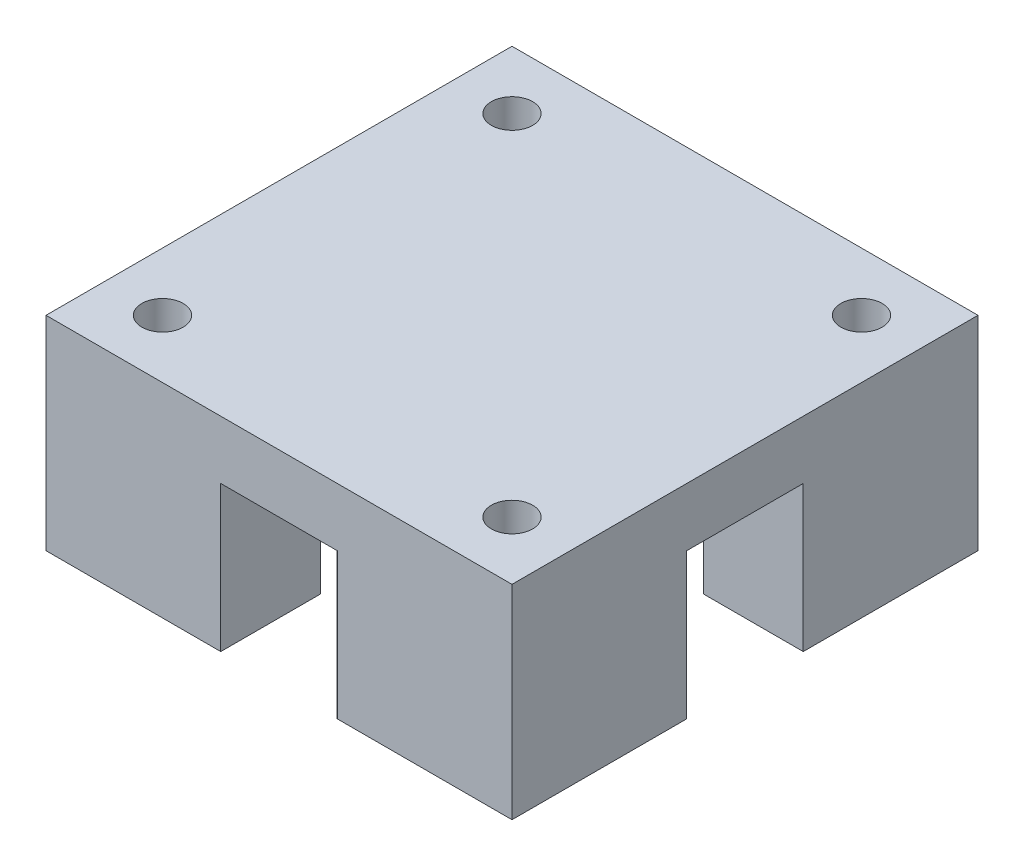
ISO-10303-21;
HEADER;
FILE_DESCRIPTION(('STEP AP214'),'2;1');
FILE_NAME('part.step','',(''),(''),'','','');
FILE_SCHEMA(('AUTOMOTIVE_DESIGN { 1 0 10303 214 1 1 1 1 }'));
ENDSEC;
DATA;
#1=APPLICATION_CONTEXT('core data for automotive mechanical design processes');
#2=APPLICATION_PROTOCOL_DEFINITION('international standard','automotive_design',2000,#1);
#3=PRODUCT_CONTEXT('',#1,'mechanical');
#4=PRODUCT('Part','Part','',(#3));
#5=PRODUCT_RELATED_PRODUCT_CATEGORY('part','',(#4));
#6=PRODUCT_DEFINITION_FORMATION('','',#4);
#7=PRODUCT_DEFINITION_CONTEXT('part definition',#1,'design');
#8=PRODUCT_DEFINITION('design','',#6,#7);
#9=PRODUCT_DEFINITION_SHAPE('','',#8);
#10=(LENGTH_UNIT() NAMED_UNIT(*) SI_UNIT(.MILLI.,.METRE.));
#11=(NAMED_UNIT(*) PLANE_ANGLE_UNIT() SI_UNIT($,.RADIAN.));
#12=(NAMED_UNIT(*) SI_UNIT($,.STERADIAN.) SOLID_ANGLE_UNIT());
#13=UNCERTAINTY_MEASURE_WITH_UNIT(LENGTH_MEASURE(1.E-05),#10,'distance_accuracy_value','');
#14=(GEOMETRIC_REPRESENTATION_CONTEXT(3) GLOBAL_UNCERTAINTY_ASSIGNED_CONTEXT((#13)) GLOBAL_UNIT_ASSIGNED_CONTEXT((#10,
#11,#12)) REPRESENTATION_CONTEXT('',''));
#15=CARTESIAN_POINT('',(0.,0.,0.));
#16=DIRECTION('',(0.,0.,1.));
#17=DIRECTION('',(1.,0.,0.));
#18=AXIS2_PLACEMENT_3D('',#15,#16,#17);
#19=CARTESIAN_POINT('',(25.4,22.225,-25.4));
#20=DIRECTION('',(-1.,0.,0.));
#21=DIRECTION('',(0.,0.,1.));
#22=AXIS2_PLACEMENT_3D('',#19,#20,#21);
#23=PLANE('',#22);
#24=DIRECTION('',(0.,-1.,0.));
#25=VECTOR('',#24,1.);
#26=CARTESIAN_POINT('',(25.4,15.875,6.35));
#27=LINE('',#26,#25);
#28=CARTESIAN_POINT('',(25.4,15.875,6.35));
#29=VERTEX_POINT('',#28);
#30=CARTESIAN_POINT('',(25.4,0.,6.35));
#31=VERTEX_POINT('',#30);
#32=EDGE_CURVE('E297',#29,#31,#27,.T.);
#33=ORIENTED_EDGE('',*,*,#32,.F.);
#34=DIRECTION('',(0.,0.,1.));
#35=VECTOR('',#34,1.);
#36=CARTESIAN_POINT('',(25.4,15.875,0.));
#37=LINE('',#36,#35);
#38=CARTESIAN_POINT('',(25.4,15.875,-6.35));
#39=VERTEX_POINT('',#38);
#40=EDGE_CURVE('E195',#39,#29,#37,.T.);
#41=ORIENTED_EDGE('',*,*,#40,.F.);
#42=DIRECTION('',(0.,-1.,0.));
#43=VECTOR('',#42,1.);
#44=CARTESIAN_POINT('',(25.4,15.875,-6.35));
#45=LINE('',#44,#43);
#46=CARTESIAN_POINT('',(25.4,0.,-6.35));
#47=VERTEX_POINT('',#46);
#48=EDGE_CURVE('E185',#39,#47,#45,.T.);
#49=ORIENTED_EDGE('',*,*,#48,.T.);
#50=DIRECTION('',(0.,0.,-1.));
#51=VECTOR('',#50,1.);
#52=CARTESIAN_POINT('',(25.4,0.,-25.4));
#53=LINE('',#52,#51);
#54=CARTESIAN_POINT('',(25.4,0.,-25.4));
#55=VERTEX_POINT('',#54);
#56=EDGE_CURVE('E323',#47,#55,#53,.T.);
#57=ORIENTED_EDGE('',*,*,#56,.T.);
#58=DIRECTION('',(0.,-1.,0.));
#59=VECTOR('',#58,1.);
#60=CARTESIAN_POINT('',(25.4,22.225,-25.4));
#61=LINE('',#60,#59);
#62=CARTESIAN_POINT('',(25.4,22.225,-25.4));
#63=VERTEX_POINT('',#62);
#64=EDGE_CURVE('E11',#63,#55,#61,.T.);
#65=ORIENTED_EDGE('',*,*,#64,.F.);
#66=DIRECTION('',(0.,0.,-1.));
#67=VECTOR('',#66,1.);
#68=CARTESIAN_POINT('',(25.4,22.225,-25.4));
#69=LINE('',#68,#67);
#70=CARTESIAN_POINT('',(25.4,22.225,25.4));
#71=VERTEX_POINT('',#70);
#72=EDGE_CURVE('E324',#71,#63,#69,.T.);
#73=ORIENTED_EDGE('',*,*,#72,.F.);
#74=DIRECTION('',(0.,-1.,0.));
#75=VECTOR('',#74,1.);
#76=CARTESIAN_POINT('',(25.4,22.225,25.4));
#77=LINE('',#76,#75);
#78=CARTESIAN_POINT('',(25.4,0.,25.4));
#79=VERTEX_POINT('',#78);
#80=EDGE_CURVE('E331',#71,#79,#77,.T.);
#81=ORIENTED_EDGE('',*,*,#80,.T.);
#82=EDGE_CURVE('E332',#79,#31,#53,.T.);
#83=ORIENTED_EDGE('',*,*,#82,.T.);
#84=EDGE_LOOP('',(#33,#41,#49,#57,#65,#73,#81,#83));
#85=FACE_BOUND('',#84,.T.);
#86=ADVANCED_FACE('F35',(#85),#23,.F.);
#87=CARTESIAN_POINT('',(-25.4,22.225,-25.4));
#88=DIRECTION('',(0.,0.,1.));
#89=DIRECTION('',(1.,0.,0.));
#90=AXIS2_PLACEMENT_3D('',#87,#88,#89);
#91=PLANE('',#90);
#92=DIRECTION('',(0.,-1.,0.));
#93=VECTOR('',#92,1.);
#94=CARTESIAN_POINT('',(6.35,15.875,-25.4));
#95=LINE('',#94,#93);
#96=CARTESIAN_POINT('',(6.35,15.875,-25.4));
#97=VERTEX_POINT('',#96);
#98=CARTESIAN_POINT('',(6.35,0.,-25.4));
#99=VERTEX_POINT('',#98);
#100=EDGE_CURVE('E271',#97,#99,#95,.T.);
#101=ORIENTED_EDGE('',*,*,#100,.F.);
#102=DIRECTION('',(1.,0.,0.));
#103=VECTOR('',#102,1.);
#104=CARTESIAN_POINT('',(0.,15.875,-25.4));
#105=LINE('',#104,#103);
#106=CARTESIAN_POINT('',(-6.35,15.875,-25.4));
#107=VERTEX_POINT('',#106);
#108=EDGE_CURVE('E237',#107,#97,#105,.T.);
#109=ORIENTED_EDGE('',*,*,#108,.F.);
#110=DIRECTION('',(0.,-1.,0.));
#111=VECTOR('',#110,1.);
#112=CARTESIAN_POINT('',(-6.35,15.875,-25.4));
#113=LINE('',#112,#111);
#114=CARTESIAN_POINT('',(-6.35,0.,-25.4));
#115=VERTEX_POINT('',#114);
#116=EDGE_CURVE('E273',#107,#115,#113,.T.);
#117=ORIENTED_EDGE('',*,*,#116,.T.);
#118=DIRECTION('',(-1.,0.,0.));
#119=VECTOR('',#118,1.);
#120=CARTESIAN_POINT('',(-25.4,0.,-25.4));
#121=LINE('',#120,#119);
#122=CARTESIAN_POINT('',(-25.4,0.,-25.4));
#123=VERTEX_POINT('',#122);
#124=EDGE_CURVE('E335',#115,#123,#121,.T.);
#125=ORIENTED_EDGE('',*,*,#124,.T.);
#126=DIRECTION('',(0.,-1.,0.));
#127=VECTOR('',#126,1.);
#128=CARTESIAN_POINT('',(-25.4,22.225,-25.4));
#129=LINE('',#128,#127);
#130=CARTESIAN_POINT('',(-25.4,22.225,-25.4));
#131=VERTEX_POINT('',#130);
#132=EDGE_CURVE('E42',#131,#123,#129,.T.);
#133=ORIENTED_EDGE('',*,*,#132,.F.);
#134=DIRECTION('',(-1.,0.,0.));
#135=VECTOR('',#134,1.);
#136=CARTESIAN_POINT('',(-25.4,22.225,-25.4));
#137=LINE('',#136,#135);
#138=EDGE_CURVE('E86',#63,#131,#137,.T.);
#139=ORIENTED_EDGE('',*,*,#138,.F.);
#140=ORIENTED_EDGE('',*,*,#64,.T.);
#141=EDGE_CURVE('E336',#55,#99,#121,.T.);
#142=ORIENTED_EDGE('',*,*,#141,.T.);
#143=EDGE_LOOP('',(#101,#109,#117,#125,#133,#139,#140,#142));
#144=FACE_BOUND('',#143,.T.);
#145=ADVANCED_FACE('F402',(#144),#91,.F.);
#146=CARTESIAN_POINT('',(0.,0.,0.));
#147=DIRECTION('',(0.,1.,0.));
#148=DIRECTION('',(0.,0.,1.));
#149=AXIS2_PLACEMENT_3D('',#146,#147,#148);
#150=PLANE('',#149);
#151=CARTESIAN_POINT('',(-19.05,0.,19.05));
#152=DIRECTION('',(0.,1.,0.));
#153=DIRECTION('',(0.,0.,1.));
#154=AXIS2_PLACEMENT_3D('',#151,#152,#153);
#155=CIRCLE('',#154,2.24789999999999);
#156=CARTESIAN_POINT('',(-19.05,0.,21.2979));
#157=VERTEX_POINT('',#156);
#158=EDGE_CURVE('E320',#157,#157,#155,.T.);
#159=ORIENTED_EDGE('',*,*,#158,.T.);
#160=EDGE_LOOP('',(#159));
#161=FACE_BOUND('',#160,.T.);
#162=DIRECTION('',(1.,0.,0.));
#163=VECTOR('',#162,1.);
#164=CARTESIAN_POINT('',(0.,0.,6.35));
#165=LINE('',#164,#163);
#166=CARTESIAN_POINT('',(-25.4,0.,6.35));
#167=VERTEX_POINT('',#166);
#168=CARTESIAN_POINT('',(-14.5496778314848,0.,6.35));
#169=VERTEX_POINT('',#168);
#170=EDGE_CURVE('E258',#167,#169,#165,.T.);
#171=ORIENTED_EDGE('',*,*,#170,.T.);
#172=CARTESIAN_POINT('',(0.,0.,0.));
#173=DIRECTION('',(0.,-1.,0.));
#174=DIRECTION('',(0.,0.,-1.));
#175=AXIS2_PLACEMENT_3D('',#172,#173,#174);
#176=CIRCLE('',#175,15.875);
#177=CARTESIAN_POINT('',(-6.35,0.,14.5496778314848));
#178=VERTEX_POINT('',#177);
#179=EDGE_CURVE('E255',#178,#169,#176,.T.);
#180=ORIENTED_EDGE('',*,*,#179,.F.);
#181=DIRECTION('',(0.,0.,-1.));
#182=VECTOR('',#181,1.);
#183=CARTESIAN_POINT('',(-6.35,0.,0.));
#184=LINE('',#183,#182);
#185=CARTESIAN_POINT('',(-6.35,0.,25.4));
#186=VERTEX_POINT('',#185);
#187=EDGE_CURVE('E252',#186,#178,#184,.T.);
#188=ORIENTED_EDGE('',*,*,#187,.F.);
#189=DIRECTION('',(1.,0.,0.));
#190=VECTOR('',#189,1.);
#191=CARTESIAN_POINT('',(-25.4,0.,25.4));
#192=LINE('',#191,#190);
#193=CARTESIAN_POINT('',(-25.4,0.,25.4));
#194=VERTEX_POINT('',#193);
#195=EDGE_CURVE('E326',#194,#186,#192,.T.);
#196=ORIENTED_EDGE('',*,*,#195,.F.);
#197=DIRECTION('',(0.,0.,1.));
#198=VECTOR('',#197,1.);
#199=CARTESIAN_POINT('',(-25.4,0.,-25.4));
#200=LINE('',#199,#198);
#201=EDGE_CURVE('E339',#167,#194,#200,.T.);
#202=ORIENTED_EDGE('',*,*,#201,.F.);
#203=EDGE_LOOP('',(#171,#180,#188,#196,#202));
#204=FACE_BOUND('',#203,.T.);
#205=ADVANCED_FACE('F376',(#161,#204),#150,.F.);
#206=CARTESIAN_POINT('',(19.05,0.,19.05));
#207=DIRECTION('',(0.,1.,0.));
#208=DIRECTION('',(0.,0.,1.));
#209=AXIS2_PLACEMENT_3D('',#206,#207,#208);
#210=CIRCLE('',#209,2.24789999999999);
#211=CARTESIAN_POINT('',(19.05,0.,21.2979));
#212=VERTEX_POINT('',#211);
#213=EDGE_CURVE('E314',#212,#212,#210,.T.);
#214=ORIENTED_EDGE('',*,*,#213,.T.);
#215=EDGE_LOOP('',(#214));
#216=FACE_BOUND('',#215,.T.);
#217=DIRECTION('',(0.,0.,-1.));
#218=VECTOR('',#217,1.);
#219=CARTESIAN_POINT('',(6.35,0.,0.));
#220=LINE('',#219,#218);
#221=CARTESIAN_POINT('',(6.35,0.,25.4));
#222=VERTEX_POINT('',#221);
#223=CARTESIAN_POINT('',(6.35,0.,14.5496778314848));
#224=VERTEX_POINT('',#223);
#225=EDGE_CURVE('E249',#222,#224,#220,.T.);
#226=ORIENTED_EDGE('',*,*,#225,.T.);
#227=CARTESIAN_POINT('',(0.,0.,0.));
#228=DIRECTION('',(0.,-1.,0.));
#229=DIRECTION('',(0.,0.,-1.));
#230=AXIS2_PLACEMENT_3D('',#227,#228,#229);
#231=CIRCLE('',#230,15.875);
#232=CARTESIAN_POINT('',(14.5496778314848,0.,6.35));
#233=VERTEX_POINT('',#232);
#234=EDGE_CURVE('E246',#233,#224,#231,.T.);
#235=ORIENTED_EDGE('',*,*,#234,.F.);
#236=DIRECTION('',(1.,0.,0.));
#237=VECTOR('',#236,1.);
#238=CARTESIAN_POINT('',(0.,0.,6.35));
#239=LINE('',#238,#237);
#240=EDGE_CURVE('E243',#233,#31,#239,.T.);
#241=ORIENTED_EDGE('',*,*,#240,.T.);
#242=ORIENTED_EDGE('',*,*,#82,.F.);
#243=EDGE_CURVE('E79',#222,#79,#192,.T.);
#244=ORIENTED_EDGE('',*,*,#243,.F.);
#245=EDGE_LOOP('',(#226,#235,#241,#242,#244));
#246=FACE_BOUND('',#245,.T.);
#247=ADVANCED_FACE('F409',(#216,#246),#150,.F.);
#248=CARTESIAN_POINT('',(19.05,0.,-19.05));
#249=DIRECTION('',(0.,1.,0.));
#250=DIRECTION('',(0.,0.,1.));
#251=AXIS2_PLACEMENT_3D('',#248,#249,#250);
#252=CIRCLE('',#251,2.24789999999999);
#253=CARTESIAN_POINT('',(19.05,0.,-16.8021));
#254=VERTEX_POINT('',#253);
#255=EDGE_CURVE('E308',#254,#254,#252,.T.);
#256=ORIENTED_EDGE('',*,*,#255,.T.);
#257=EDGE_LOOP('',(#256));
#258=FACE_BOUND('',#257,.T.);
#259=DIRECTION('',(0.,0.,-1.));
#260=VECTOR('',#259,1.);
#261=CARTESIAN_POINT('',(6.35,0.,0.));
#262=LINE('',#261,#260);
#263=CARTESIAN_POINT('',(6.35,0.,-14.5496778314848));
#264=VERTEX_POINT('',#263);
#265=EDGE_CURVE('E200',#264,#99,#262,.T.);
#266=ORIENTED_EDGE('',*,*,#265,.T.);
#267=ORIENTED_EDGE('',*,*,#141,.F.);
#268=ORIENTED_EDGE('',*,*,#56,.F.);
#269=DIRECTION('',(1.,0.,0.));
#270=VECTOR('',#269,1.);
#271=CARTESIAN_POINT('',(0.,0.,-6.35));
#272=LINE('',#271,#270);
#273=CARTESIAN_POINT('',(14.5496778314848,0.,-6.35));
#274=VERTEX_POINT('',#273);
#275=EDGE_CURVE('E241',#274,#47,#272,.T.);
#276=ORIENTED_EDGE('',*,*,#275,.F.);
#277=CARTESIAN_POINT('',(0.,0.,0.));
#278=DIRECTION('',(0.,-1.,0.));
#279=DIRECTION('',(0.,0.,-1.));
#280=AXIS2_PLACEMENT_3D('',#277,#278,#279);
#281=CIRCLE('',#280,15.875);
#282=EDGE_CURVE('E49',#264,#274,#281,.T.);
#283=ORIENTED_EDGE('',*,*,#282,.F.);
#284=EDGE_LOOP('',(#266,#267,#268,#276,#283));
#285=FACE_BOUND('',#284,.T.);
#286=ADVANCED_FACE('F396',(#258,#285),#150,.F.);
#287=CARTESIAN_POINT('',(-25.4,22.225,-25.4));
#288=DIRECTION('',(1.,0.,0.));
#289=DIRECTION('',(0.,0.,-1.));
#290=AXIS2_PLACEMENT_3D('',#287,#288,#289);
#291=PLANE('',#290);
#292=CARTESIAN_POINT('',(-25.4,0.,-6.35));
#293=VERTEX_POINT('',#292);
#294=EDGE_CURVE('E340',#123,#293,#200,.T.);
#295=ORIENTED_EDGE('',*,*,#294,.T.);
#296=DIRECTION('',(0.,-1.,0.));
#297=VECTOR('',#296,1.);
#298=CARTESIAN_POINT('',(-25.4,15.875,-6.35));
#299=LINE('',#298,#297);
#300=CARTESIAN_POINT('',(-25.4,15.875,-6.35));
#301=VERTEX_POINT('',#300);
#302=EDGE_CURVE('E280',#301,#293,#299,.T.);
#303=ORIENTED_EDGE('',*,*,#302,.F.);
#304=DIRECTION('',(0.,0.,-1.));
#305=VECTOR('',#304,1.);
#306=CARTESIAN_POINT('',(-25.4,15.875,0.));
#307=LINE('',#306,#305);
#308=CARTESIAN_POINT('',(-25.4,15.875,6.35));
#309=VERTEX_POINT('',#308);
#310=EDGE_CURVE('E225',#309,#301,#307,.T.);
#311=ORIENTED_EDGE('',*,*,#310,.F.);
#312=DIRECTION('',(0.,-1.,0.));
#313=VECTOR('',#312,1.);
#314=CARTESIAN_POINT('',(-25.4,15.875,6.35));
#315=LINE('',#314,#313);
#316=EDGE_CURVE('E282',#309,#167,#315,.T.);
#317=ORIENTED_EDGE('',*,*,#316,.T.);
#318=ORIENTED_EDGE('',*,*,#201,.T.);
#319=DIRECTION('',(0.,-1.,0.));
#320=VECTOR('',#319,1.);
#321=CARTESIAN_POINT('',(-25.4,22.225,25.4));
#322=LINE('',#321,#320);
#323=CARTESIAN_POINT('',(-25.4,22.225,25.4));
#324=VERTEX_POINT('',#323);
#325=EDGE_CURVE('E346',#324,#194,#322,.T.);
#326=ORIENTED_EDGE('',*,*,#325,.F.);
#327=DIRECTION('',(0.,0.,1.));
#328=VECTOR('',#327,1.);
#329=CARTESIAN_POINT('',(-25.4,22.225,-25.4));
#330=LINE('',#329,#328);
#331=EDGE_CURVE('E328',#131,#324,#330,.T.);
#332=ORIENTED_EDGE('',*,*,#331,.F.);
#333=ORIENTED_EDGE('',*,*,#132,.T.);
#334=EDGE_LOOP('',(#295,#303,#311,#317,#318,#326,#332,#333));
#335=FACE_BOUND('',#334,.T.);
#336=ADVANCED_FACE('F352',(#335),#291,.F.);
#337=CARTESIAN_POINT('',(-25.4,22.225,25.4));
#338=DIRECTION('',(0.,0.,-1.));
#339=DIRECTION('',(-1.,0.,0.));
#340=AXIS2_PLACEMENT_3D('',#337,#338,#339);
#341=PLANE('',#340);
#342=ORIENTED_EDGE('',*,*,#195,.T.);
#343=DIRECTION('',(0.,-1.,0.));
#344=VECTOR('',#343,1.);
#345=CARTESIAN_POINT('',(-6.35,15.875,25.4));
#346=LINE('',#345,#344);
#347=CARTESIAN_POINT('',(-6.35,15.875,25.4));
#348=VERTEX_POINT('',#347);
#349=EDGE_CURVE('E289',#348,#186,#346,.T.);
#350=ORIENTED_EDGE('',*,*,#349,.F.);
#351=DIRECTION('',(-1.,0.,0.));
#352=VECTOR('',#351,1.);
#353=CARTESIAN_POINT('',(0.,15.875,25.4));
#354=LINE('',#353,#352);
#355=CARTESIAN_POINT('',(6.35,15.875,25.4));
#356=VERTEX_POINT('',#355);
#357=EDGE_CURVE('E214',#356,#348,#354,.T.);
#358=ORIENTED_EDGE('',*,*,#357,.F.);
#359=DIRECTION('',(0.,-1.,0.));
#360=VECTOR('',#359,1.);
#361=CARTESIAN_POINT('',(6.35,15.875,25.4));
#362=LINE('',#361,#360);
#363=EDGE_CURVE('E291',#356,#222,#362,.T.);
#364=ORIENTED_EDGE('',*,*,#363,.T.);
#365=ORIENTED_EDGE('',*,*,#243,.T.);
#366=ORIENTED_EDGE('',*,*,#80,.F.);
#367=DIRECTION('',(1.,0.,0.));
#368=VECTOR('',#367,1.);
#369=CARTESIAN_POINT('',(-25.4,22.225,25.4));
#370=LINE('',#369,#368);
#371=EDGE_CURVE('E58',#324,#71,#370,.T.);
#372=ORIENTED_EDGE('',*,*,#371,.F.);
#373=ORIENTED_EDGE('',*,*,#325,.T.);
#374=EDGE_LOOP('',(#342,#350,#358,#364,#365,#366,#372,#373));
#375=FACE_BOUND('',#374,.T.);
#376=ADVANCED_FACE('F378',(#375),#341,.F.);
#377=CARTESIAN_POINT('',(0.,22.225,0.));
#378=DIRECTION('',(0.,1.,0.));
#379=DIRECTION('',(0.,0.,1.));
#380=AXIS2_PLACEMENT_3D('',#377,#378,#379);
#381=PLANE('',#380);
#382=CARTESIAN_POINT('',(-19.05,22.225,-19.05));
#383=DIRECTION('',(0.,1.,0.));
#384=DIRECTION('',(0.,0.,1.));
#385=AXIS2_PLACEMENT_3D('',#382,#383,#384);
#386=CIRCLE('',#385,2.2479);
#387=CARTESIAN_POINT('',(-19.05,22.225,-16.8021));
#388=VERTEX_POINT('',#387);
#389=EDGE_CURVE('E270',#388,#388,#386,.T.);
#390=ORIENTED_EDGE('',*,*,#389,.F.);
#391=EDGE_LOOP('',(#390));
#392=FACE_BOUND('',#391,.T.);
#393=CARTESIAN_POINT('',(19.05,22.225,-19.05));
#394=DIRECTION('',(0.,1.,0.));
#395=DIRECTION('',(0.,0.,1.));
#396=AXIS2_PLACEMENT_3D('',#393,#394,#395);
#397=CIRCLE('',#396,2.2479);
#398=CARTESIAN_POINT('',(19.05,22.225,-16.8021));
#399=VERTEX_POINT('',#398);
#400=EDGE_CURVE('E305',#399,#399,#397,.T.);
#401=ORIENTED_EDGE('',*,*,#400,.F.);
#402=EDGE_LOOP('',(#401));
#403=FACE_BOUND('',#402,.T.);
#404=CARTESIAN_POINT('',(19.05,22.225,19.05));
#405=DIRECTION('',(0.,1.,0.));
#406=DIRECTION('',(0.,0.,1.));
#407=AXIS2_PLACEMENT_3D('',#404,#405,#406);
#408=CIRCLE('',#407,2.2479);
#409=CARTESIAN_POINT('',(19.05,22.225,21.2979));
#410=VERTEX_POINT('',#409);
#411=EDGE_CURVE('E311',#410,#410,#408,.T.);
#412=ORIENTED_EDGE('',*,*,#411,.F.);
#413=EDGE_LOOP('',(#412));
#414=FACE_BOUND('',#413,.T.);
#415=CARTESIAN_POINT('',(-19.05,22.225,19.05));
#416=DIRECTION('',(0.,1.,0.));
#417=DIRECTION('',(0.,0.,1.));
#418=AXIS2_PLACEMENT_3D('',#415,#416,#417);
#419=CIRCLE('',#418,2.2479);
#420=CARTESIAN_POINT('',(-19.05,22.225,21.2979));
#421=VERTEX_POINT('',#420);
#422=EDGE_CURVE('E317',#421,#421,#419,.T.);
#423=ORIENTED_EDGE('',*,*,#422,.F.);
#424=EDGE_LOOP('',(#423));
#425=FACE_BOUND('',#424,.T.);
#426=ORIENTED_EDGE('',*,*,#72,.T.);
#427=ORIENTED_EDGE('',*,*,#138,.T.);
#428=ORIENTED_EDGE('',*,*,#331,.T.);
#429=ORIENTED_EDGE('',*,*,#371,.T.);
#430=EDGE_LOOP('',(#426,#427,#428,#429));
#431=FACE_BOUND('',#430,.T.);
#432=ADVANCED_FACE('F385',(#392,#403,#414,#425,#431),#381,.T.);
#433=CARTESIAN_POINT('',(-19.05,0.,-19.05));
#434=DIRECTION('',(0.,1.,0.));
#435=DIRECTION('',(0.,0.,1.));
#436=AXIS2_PLACEMENT_3D('',#433,#434,#435);
#437=CIRCLE('',#436,2.24789999999999);
#438=CARTESIAN_POINT('',(-19.05,0.,-16.8021));
#439=VERTEX_POINT('',#438);
#440=EDGE_CURVE('E302',#439,#439,#437,.T.);
#441=ORIENTED_EDGE('',*,*,#440,.T.);
#442=EDGE_LOOP('',(#441));
#443=FACE_BOUND('',#442,.T.);
#444=ORIENTED_EDGE('',*,*,#124,.F.);
#445=DIRECTION('',(0.,0.,-1.));
#446=VECTOR('',#445,1.);
#447=CARTESIAN_POINT('',(-6.35,0.,0.));
#448=LINE('',#447,#446);
#449=CARTESIAN_POINT('',(-6.35,0.,-14.5496778314848));
#450=VERTEX_POINT('',#449);
#451=EDGE_CURVE('E203',#450,#115,#448,.T.);
#452=ORIENTED_EDGE('',*,*,#451,.F.);
#453=CARTESIAN_POINT('',(0.,0.,0.));
#454=DIRECTION('',(0.,-1.,0.));
#455=DIRECTION('',(0.,0.,-1.));
#456=AXIS2_PLACEMENT_3D('',#453,#454,#455);
#457=CIRCLE('',#456,15.875);
#458=CARTESIAN_POINT('',(-14.5496778314848,0.,-6.35));
#459=VERTEX_POINT('',#458);
#460=EDGE_CURVE('E264',#459,#450,#457,.T.);
#461=ORIENTED_EDGE('',*,*,#460,.F.);
#462=DIRECTION('',(1.,0.,0.));
#463=VECTOR('',#462,1.);
#464=CARTESIAN_POINT('',(0.,0.,-6.35));
#465=LINE('',#464,#463);
#466=EDGE_CURVE('E261',#293,#459,#465,.T.);
#467=ORIENTED_EDGE('',*,*,#466,.F.);
#468=ORIENTED_EDGE('',*,*,#294,.F.);
#469=EDGE_LOOP('',(#444,#452,#461,#467,#468));
#470=FACE_BOUND('',#469,.T.);
#471=ADVANCED_FACE('F358',(#443,#470),#150,.F.);
#472=CARTESIAN_POINT('',(-19.05,22.225,19.05));
#473=DIRECTION('',(0.,1.,0.));
#474=DIRECTION('',(0.,0.,1.));
#475=AXIS2_PLACEMENT_3D('',#472,#473,#474);
#476=CYLINDRICAL_SURFACE('',#475,2.2479);
#477=ORIENTED_EDGE('',*,*,#158,.F.);
#478=EDGE_LOOP('',(#477));
#479=FACE_BOUND('',#478,.T.);
#480=ORIENTED_EDGE('',*,*,#422,.T.);
#481=EDGE_LOOP('',(#480));
#482=FACE_BOUND('',#481,.T.);
#483=ADVANCED_FACE('F393',(#479,#482),#476,.F.);
#484=CARTESIAN_POINT('',(19.05,22.225,19.05));
#485=DIRECTION('',(0.,1.,0.));
#486=DIRECTION('',(0.,0.,1.));
#487=AXIS2_PLACEMENT_3D('',#484,#485,#486);
#488=CYLINDRICAL_SURFACE('',#487,2.2479);
#489=ORIENTED_EDGE('',*,*,#213,.F.);
#490=EDGE_LOOP('',(#489));
#491=FACE_BOUND('',#490,.T.);
#492=ORIENTED_EDGE('',*,*,#411,.T.);
#493=EDGE_LOOP('',(#492));
#494=FACE_BOUND('',#493,.T.);
#495=ADVANCED_FACE('F476',(#491,#494),#488,.F.);
#496=CARTESIAN_POINT('',(19.05,22.225,-19.05));
#497=DIRECTION('',(0.,1.,0.));
#498=DIRECTION('',(0.,0.,1.));
#499=AXIS2_PLACEMENT_3D('',#496,#497,#498);
#500=CYLINDRICAL_SURFACE('',#499,2.2479);
#501=ORIENTED_EDGE('',*,*,#255,.F.);
#502=EDGE_LOOP('',(#501));
#503=FACE_BOUND('',#502,.T.);
#504=ORIENTED_EDGE('',*,*,#400,.T.);
#505=EDGE_LOOP('',(#504));
#506=FACE_BOUND('',#505,.T.);
#507=ADVANCED_FACE('F472',(#503,#506),#500,.F.);
#508=CARTESIAN_POINT('',(-19.05,22.225,-19.05));
#509=DIRECTION('',(0.,1.,0.));
#510=DIRECTION('',(0.,0.,1.));
#511=AXIS2_PLACEMENT_3D('',#508,#509,#510);
#512=CYLINDRICAL_SURFACE('',#511,2.2479);
#513=ORIENTED_EDGE('',*,*,#440,.F.);
#514=EDGE_LOOP('',(#513));
#515=FACE_BOUND('',#514,.T.);
#516=ORIENTED_EDGE('',*,*,#389,.T.);
#517=EDGE_LOOP('',(#516));
#518=FACE_BOUND('',#517,.T.);
#519=ADVANCED_FACE('F469',(#515,#518),#512,.F.);
#520=CARTESIAN_POINT('',(0.,15.875,0.));
#521=DIRECTION('',(0.,-1.,0.));
#522=DIRECTION('',(0.,0.,-1.));
#523=AXIS2_PLACEMENT_3D('',#520,#521,#522);
#524=CYLINDRICAL_SURFACE('',#523,15.875);
#525=ORIENTED_EDGE('',*,*,#282,.T.);
#526=DIRECTION('',(0.,-1.,0.));
#527=VECTOR('',#526,1.);
#528=CARTESIAN_POINT('',(14.5496778314848,15.875,-6.35));
#529=LINE('',#528,#527);
#530=CARTESIAN_POINT('',(14.5496778314848,15.875,-6.35));
#531=VERTEX_POINT('',#530);
#532=EDGE_CURVE('E178',#531,#274,#529,.T.);
#533=ORIENTED_EDGE('',*,*,#532,.F.);
#534=CARTESIAN_POINT('',(0.,15.875,0.));
#535=DIRECTION('',(0.,-1.,0.));
#536=DIRECTION('',(0.,0.,-1.));
#537=AXIS2_PLACEMENT_3D('',#534,#535,#536);
#538=CIRCLE('',#537,15.875);
#539=CARTESIAN_POINT('',(6.35,15.875,-14.5496778314848));
#540=VERTEX_POINT('',#539);
#541=EDGE_CURVE('E182',#540,#531,#538,.T.);
#542=ORIENTED_EDGE('',*,*,#541,.F.);
#543=DIRECTION('',(0.,-1.,0.));
#544=VECTOR('',#543,1.);
#545=CARTESIAN_POINT('',(6.35,15.875,-14.5496778314848));
#546=LINE('',#545,#544);
#547=EDGE_CURVE('E268',#540,#264,#546,.T.);
#548=ORIENTED_EDGE('',*,*,#547,.T.);
#549=EDGE_LOOP('',(#525,#533,#542,#548));
#550=FACE_BOUND('',#549,.T.);
#551=ADVANCED_FACE('F180',(#550),#524,.F.);
#552=CARTESIAN_POINT('',(6.35,15.875,0.));
#553=DIRECTION('',(-1.,0.,0.));
#554=DIRECTION('',(0.,0.,1.));
#555=AXIS2_PLACEMENT_3D('',#552,#553,#554);
#556=PLANE('',#555);
#557=ORIENTED_EDGE('',*,*,#265,.F.);
#558=ORIENTED_EDGE('',*,*,#547,.F.);
#559=DIRECTION('',(0.,0.,-1.));
#560=VECTOR('',#559,1.);
#561=CARTESIAN_POINT('',(6.35,15.875,0.));
#562=LINE('',#561,#560);
#563=EDGE_CURVE('E186',#540,#97,#562,.T.);
#564=ORIENTED_EDGE('',*,*,#563,.T.);
#565=ORIENTED_EDGE('',*,*,#100,.T.);
#566=EDGE_LOOP('',(#557,#558,#564,#565));
#567=FACE_BOUND('',#566,.T.);
#568=ADVANCED_FACE('F429',(#567),#556,.T.);
#569=CARTESIAN_POINT('',(-6.35,15.875,0.));
#570=DIRECTION('',(-1.,0.,0.));
#571=DIRECTION('',(0.,0.,1.));
#572=AXIS2_PLACEMENT_3D('',#569,#570,#571);
#573=PLANE('',#572);
#574=ORIENTED_EDGE('',*,*,#451,.T.);
#575=ORIENTED_EDGE('',*,*,#116,.F.);
#576=DIRECTION('',(0.,0.,-1.));
#577=VECTOR('',#576,1.);
#578=CARTESIAN_POINT('',(-6.35,15.875,0.));
#579=LINE('',#578,#577);
#580=CARTESIAN_POINT('',(-6.35,15.875,-14.5496778314848));
#581=VERTEX_POINT('',#580);
#582=EDGE_CURVE('E234',#581,#107,#579,.T.);
#583=ORIENTED_EDGE('',*,*,#582,.F.);
#584=DIRECTION('',(0.,-1.,0.));
#585=VECTOR('',#584,1.);
#586=CARTESIAN_POINT('',(-6.35,15.875,-14.5496778314848));
#587=LINE('',#586,#585);
#588=EDGE_CURVE('E276',#581,#450,#587,.T.);
#589=ORIENTED_EDGE('',*,*,#588,.T.);
#590=EDGE_LOOP('',(#574,#575,#583,#589));
#591=FACE_BOUND('',#590,.T.);
#592=ADVANCED_FACE('F432',(#591),#573,.F.);
#593=CARTESIAN_POINT('',(0.,15.875,0.));
#594=DIRECTION('',(0.,-1.,0.));
#595=DIRECTION('',(0.,0.,-1.));
#596=AXIS2_PLACEMENT_3D('',#593,#594,#595);
#597=CYLINDRICAL_SURFACE('',#596,15.875);
#598=ORIENTED_EDGE('',*,*,#460,.T.);
#599=ORIENTED_EDGE('',*,*,#588,.F.);
#600=CARTESIAN_POINT('',(0.,15.875,0.));
#601=DIRECTION('',(0.,-1.,0.));
#602=DIRECTION('',(0.,0.,-1.));
#603=AXIS2_PLACEMENT_3D('',#600,#601,#602);
#604=CIRCLE('',#603,15.875);
#605=CARTESIAN_POINT('',(-14.5496778314848,15.875,-6.35));
#606=VERTEX_POINT('',#605);
#607=EDGE_CURVE('E231',#606,#581,#604,.T.);
#608=ORIENTED_EDGE('',*,*,#607,.F.);
#609=DIRECTION('',(0.,-1.,0.));
#610=VECTOR('',#609,1.);
#611=CARTESIAN_POINT('',(-14.5496778314848,15.875,-6.35));
#612=LINE('',#611,#610);
#613=EDGE_CURVE('E278',#606,#459,#612,.T.);
#614=ORIENTED_EDGE('',*,*,#613,.T.);
#615=EDGE_LOOP('',(#598,#599,#608,#614));
#616=FACE_BOUND('',#615,.T.);
#617=ADVANCED_FACE('F434',(#616),#597,.F.);
#618=CARTESIAN_POINT('',(0.,15.875,-6.35));
#619=DIRECTION('',(0.,0.,-1.));
#620=DIRECTION('',(-1.,0.,0.));
#621=AXIS2_PLACEMENT_3D('',#618,#619,#620);
#622=PLANE('',#621);
#623=ORIENTED_EDGE('',*,*,#466,.T.);
#624=ORIENTED_EDGE('',*,*,#613,.F.);
#625=DIRECTION('',(1.,0.,0.));
#626=VECTOR('',#625,1.);
#627=CARTESIAN_POINT('',(0.,15.875,-6.35));
#628=LINE('',#627,#626);
#629=EDGE_CURVE('E228',#301,#606,#628,.T.);
#630=ORIENTED_EDGE('',*,*,#629,.F.);
#631=ORIENTED_EDGE('',*,*,#302,.T.);
#632=EDGE_LOOP('',(#623,#624,#630,#631));
#633=FACE_BOUND('',#632,.T.);
#634=ADVANCED_FACE('F362',(#633),#622,.F.);
#635=CARTESIAN_POINT('',(0.,15.875,6.35));
#636=DIRECTION('',(0.,0.,-1.));
#637=DIRECTION('',(-1.,0.,0.));
#638=AXIS2_PLACEMENT_3D('',#635,#636,#637);
#639=PLANE('',#638);
#640=ORIENTED_EDGE('',*,*,#170,.F.);
#641=ORIENTED_EDGE('',*,*,#316,.F.);
#642=DIRECTION('',(1.,0.,0.));
#643=VECTOR('',#642,1.);
#644=CARTESIAN_POINT('',(0.,15.875,6.35));
#645=LINE('',#644,#643);
#646=CARTESIAN_POINT('',(-14.5496778314848,15.875,6.35));
#647=VERTEX_POINT('',#646);
#648=EDGE_CURVE('E223',#309,#647,#645,.T.);
#649=ORIENTED_EDGE('',*,*,#648,.T.);
#650=DIRECTION('',(0.,-1.,0.));
#651=VECTOR('',#650,1.);
#652=CARTESIAN_POINT('',(-14.5496778314848,15.875,6.35));
#653=LINE('',#652,#651);
#654=EDGE_CURVE('E285',#647,#169,#653,.T.);
#655=ORIENTED_EDGE('',*,*,#654,.T.);
#656=EDGE_LOOP('',(#640,#641,#649,#655));
#657=FACE_BOUND('',#656,.T.);
#658=ADVANCED_FACE('F370',(#657),#639,.T.);
#659=CARTESIAN_POINT('',(0.,15.875,0.));
#660=DIRECTION('',(0.,-1.,0.));
#661=DIRECTION('',(0.,0.,-1.));
#662=AXIS2_PLACEMENT_3D('',#659,#660,#661);
#663=CYLINDRICAL_SURFACE('',#662,15.875);
#664=ORIENTED_EDGE('',*,*,#179,.T.);
#665=ORIENTED_EDGE('',*,*,#654,.F.);
#666=CARTESIAN_POINT('',(0.,15.875,0.));
#667=DIRECTION('',(0.,-1.,0.));
#668=DIRECTION('',(0.,0.,-1.));
#669=AXIS2_PLACEMENT_3D('',#666,#667,#668);
#670=CIRCLE('',#669,15.875);
#671=CARTESIAN_POINT('',(-6.35,15.875,14.5496778314848));
#672=VERTEX_POINT('',#671);
#673=EDGE_CURVE('E220',#672,#647,#670,.T.);
#674=ORIENTED_EDGE('',*,*,#673,.F.);
#675=DIRECTION('',(0.,-1.,0.));
#676=VECTOR('',#675,1.);
#677=CARTESIAN_POINT('',(-6.35,15.875,14.5496778314848));
#678=LINE('',#677,#676);
#679=EDGE_CURVE('E287',#672,#178,#678,.T.);
#680=ORIENTED_EDGE('',*,*,#679,.T.);
#681=EDGE_LOOP('',(#664,#665,#674,#680));
#682=FACE_BOUND('',#681,.T.);
#683=ADVANCED_FACE('F372',(#682),#663,.F.);
#684=CARTESIAN_POINT('',(-6.35,15.875,0.));
#685=DIRECTION('',(-1.,0.,0.));
#686=DIRECTION('',(0.,0.,1.));
#687=AXIS2_PLACEMENT_3D('',#684,#685,#686);
#688=PLANE('',#687);
#689=ORIENTED_EDGE('',*,*,#187,.T.);
#690=ORIENTED_EDGE('',*,*,#679,.F.);
#691=DIRECTION('',(0.,0.,-1.));
#692=VECTOR('',#691,1.);
#693=CARTESIAN_POINT('',(-6.35,15.875,0.));
#694=LINE('',#693,#692);
#695=EDGE_CURVE('E217',#348,#672,#694,.T.);
#696=ORIENTED_EDGE('',*,*,#695,.F.);
#697=ORIENTED_EDGE('',*,*,#349,.T.);
#698=EDGE_LOOP('',(#689,#690,#696,#697));
#699=FACE_BOUND('',#698,.T.);
#700=ADVANCED_FACE('F449',(#699),#688,.F.);
#701=CARTESIAN_POINT('',(6.35,15.875,0.));
#702=DIRECTION('',(-1.,0.,0.));
#703=DIRECTION('',(0.,0.,1.));
#704=AXIS2_PLACEMENT_3D('',#701,#702,#703);
#705=PLANE('',#704);
#706=ORIENTED_EDGE('',*,*,#225,.F.);
#707=ORIENTED_EDGE('',*,*,#363,.F.);
#708=DIRECTION('',(0.,0.,-1.));
#709=VECTOR('',#708,1.);
#710=CARTESIAN_POINT('',(6.35,15.875,0.));
#711=LINE('',#710,#709);
#712=CARTESIAN_POINT('',(6.35,15.875,14.5496778314848));
#713=VERTEX_POINT('',#712);
#714=EDGE_CURVE('E212',#356,#713,#711,.T.);
#715=ORIENTED_EDGE('',*,*,#714,.T.);
#716=DIRECTION('',(0.,-1.,0.));
#717=VECTOR('',#716,1.);
#718=CARTESIAN_POINT('',(6.35,15.875,14.5496778314848));
#719=LINE('',#718,#717);
#720=EDGE_CURVE('E293',#713,#224,#719,.T.);
#721=ORIENTED_EDGE('',*,*,#720,.T.);
#722=EDGE_LOOP('',(#706,#707,#715,#721));
#723=FACE_BOUND('',#722,.T.);
#724=ADVANCED_FACE('F452',(#723),#705,.T.);
#725=CARTESIAN_POINT('',(0.,15.875,0.));
#726=DIRECTION('',(0.,-1.,0.));
#727=DIRECTION('',(0.,0.,-1.));
#728=AXIS2_PLACEMENT_3D('',#725,#726,#727);
#729=CYLINDRICAL_SURFACE('',#728,15.875);
#730=ORIENTED_EDGE('',*,*,#234,.T.);
#731=ORIENTED_EDGE('',*,*,#720,.F.);
#732=CARTESIAN_POINT('',(0.,15.875,0.));
#733=DIRECTION('',(0.,-1.,0.));
#734=DIRECTION('',(0.,0.,-1.));
#735=AXIS2_PLACEMENT_3D('',#732,#733,#734);
#736=CIRCLE('',#735,15.875);
#737=CARTESIAN_POINT('',(14.5496778314848,15.875,6.35));
#738=VERTEX_POINT('',#737);
#739=EDGE_CURVE('E209',#738,#713,#736,.T.);
#740=ORIENTED_EDGE('',*,*,#739,.F.);
#741=DIRECTION('',(0.,-1.,0.));
#742=VECTOR('',#741,1.);
#743=CARTESIAN_POINT('',(14.5496778314848,15.875,6.35));
#744=LINE('',#743,#742);
#745=EDGE_CURVE('E295',#738,#233,#744,.T.);
#746=ORIENTED_EDGE('',*,*,#745,.T.);
#747=EDGE_LOOP('',(#730,#731,#740,#746));
#748=FACE_BOUND('',#747,.T.);
#749=ADVANCED_FACE('F456',(#748),#729,.F.);
#750=CARTESIAN_POINT('',(0.,15.875,6.35));
#751=DIRECTION('',(0.,0.,-1.));
#752=DIRECTION('',(-1.,0.,0.));
#753=AXIS2_PLACEMENT_3D('',#750,#751,#752);
#754=PLANE('',#753);
#755=ORIENTED_EDGE('',*,*,#240,.F.);
#756=ORIENTED_EDGE('',*,*,#745,.F.);
#757=DIRECTION('',(1.,0.,0.));
#758=VECTOR('',#757,1.);
#759=CARTESIAN_POINT('',(0.,15.875,6.35));
#760=LINE('',#759,#758);
#761=EDGE_CURVE('E207',#738,#29,#760,.T.);
#762=ORIENTED_EDGE('',*,*,#761,.T.);
#763=ORIENTED_EDGE('',*,*,#32,.T.);
#764=EDGE_LOOP('',(#755,#756,#762,#763));
#765=FACE_BOUND('',#764,.T.);
#766=ADVANCED_FACE('F460',(#765),#754,.T.);
#767=CARTESIAN_POINT('',(0.,15.875,-6.35));
#768=DIRECTION('',(0.,0.,-1.));
#769=DIRECTION('',(-1.,0.,0.));
#770=AXIS2_PLACEMENT_3D('',#767,#768,#769);
#771=PLANE('',#770);
#772=ORIENTED_EDGE('',*,*,#275,.T.);
#773=ORIENTED_EDGE('',*,*,#48,.F.);
#774=DIRECTION('',(1.,0.,0.));
#775=VECTOR('',#774,1.);
#776=CARTESIAN_POINT('',(0.,15.875,-6.35));
#777=LINE('',#776,#775);
#778=EDGE_CURVE('E189',#531,#39,#777,.T.);
#779=ORIENTED_EDGE('',*,*,#778,.F.);
#780=ORIENTED_EDGE('',*,*,#532,.T.);
#781=EDGE_LOOP('',(#772,#773,#779,#780));
#782=FACE_BOUND('',#781,.T.);
#783=ADVANCED_FACE('F190',(#782),#771,.F.);
#784=CARTESIAN_POINT('',(0.,15.875,0.));
#785=DIRECTION('',(0.,-1.,0.));
#786=DIRECTION('',(0.,0.,-1.));
#787=AXIS2_PLACEMENT_3D('',#784,#785,#786);
#788=PLANE('',#787);
#789=ORIENTED_EDGE('',*,*,#541,.T.);
#790=ORIENTED_EDGE('',*,*,#778,.T.);
#791=ORIENTED_EDGE('',*,*,#40,.T.);
#792=ORIENTED_EDGE('',*,*,#761,.F.);
#793=ORIENTED_EDGE('',*,*,#739,.T.);
#794=ORIENTED_EDGE('',*,*,#714,.F.);
#795=ORIENTED_EDGE('',*,*,#357,.T.);
#796=ORIENTED_EDGE('',*,*,#695,.T.);
#797=ORIENTED_EDGE('',*,*,#673,.T.);
#798=ORIENTED_EDGE('',*,*,#648,.F.);
#799=ORIENTED_EDGE('',*,*,#310,.T.);
#800=ORIENTED_EDGE('',*,*,#629,.T.);
#801=ORIENTED_EDGE('',*,*,#607,.T.);
#802=ORIENTED_EDGE('',*,*,#582,.T.);
#803=ORIENTED_EDGE('',*,*,#108,.T.);
#804=ORIENTED_EDGE('',*,*,#563,.F.);
#805=EDGE_LOOP('',(#789,#790,#791,#792,#793,#794,#795,#796,#797,#798,#799,#800,#801,#802,#803,#804));
#806=FACE_BOUND('',#805,.T.);
#807=ADVANCED_FACE('F198',(#806),#788,.T.);
#808=CLOSED_SHELL('',(#86,#145,#205,#247,#286,#336,#376,#432,#471,#483,#495,#507,#519,#551,#568,
#592,#617,#634,#658,#683,#700,#724,#749,#766,#783,#807));
#809=MANIFOLD_SOLID_BREP('B2',#808);
#810=ADVANCED_BREP_SHAPE_REPRESENTATION('',(#18,#809),#14);
#811=SHAPE_DEFINITION_REPRESENTATION(#9,#810);
ENDSEC;
END-ISO-10303-21;
